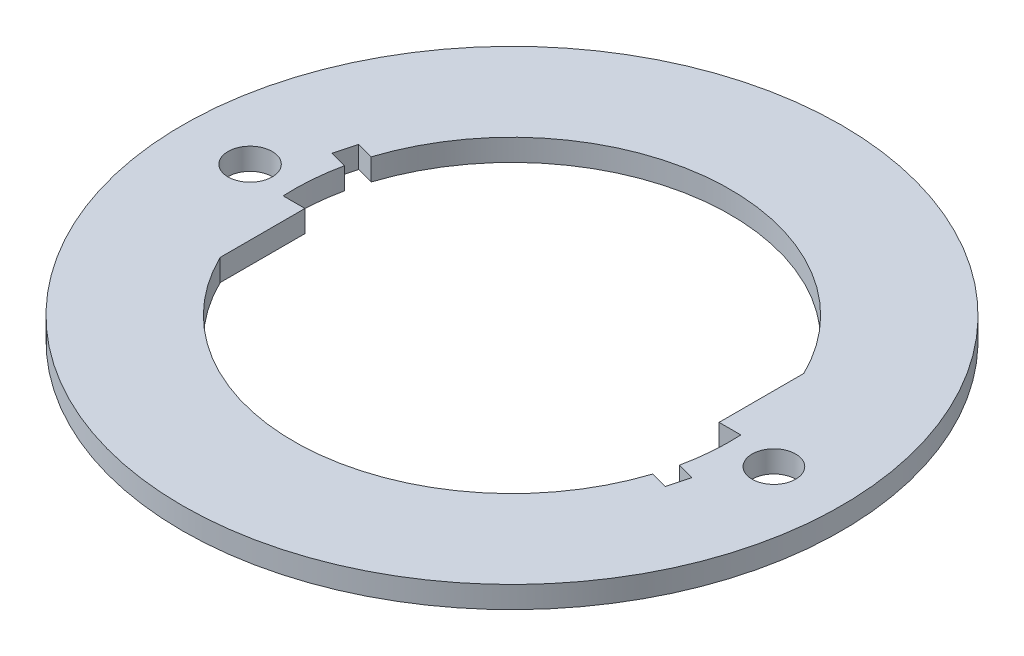
ISO-10303-21;
HEADER;
FILE_DESCRIPTION(('STEP AP214'),'2;1');
FILE_NAME('part.step','',(''),(''),'','','');
FILE_SCHEMA(('AUTOMOTIVE_DESIGN { 1 0 10303 214 1 1 1 1 }'));
ENDSEC;
DATA;
#1=APPLICATION_CONTEXT('core data for automotive mechanical design processes');
#2=APPLICATION_PROTOCOL_DEFINITION('international standard','automotive_design',2000,#1);
#3=PRODUCT_CONTEXT('',#1,'mechanical');
#4=PRODUCT('Part','Part','',(#3));
#5=PRODUCT_RELATED_PRODUCT_CATEGORY('part','',(#4));
#6=PRODUCT_DEFINITION_FORMATION('','',#4);
#7=PRODUCT_DEFINITION_CONTEXT('part definition',#1,'design');
#8=PRODUCT_DEFINITION('design','',#6,#7);
#9=PRODUCT_DEFINITION_SHAPE('','',#8);
#10=(LENGTH_UNIT() NAMED_UNIT(*) SI_UNIT(.MILLI.,.METRE.));
#11=(NAMED_UNIT(*) PLANE_ANGLE_UNIT() SI_UNIT($,.RADIAN.));
#12=(NAMED_UNIT(*) SI_UNIT($,.STERADIAN.) SOLID_ANGLE_UNIT());
#13=UNCERTAINTY_MEASURE_WITH_UNIT(LENGTH_MEASURE(1.E-05),#10,'distance_accuracy_value','');
#14=(GEOMETRIC_REPRESENTATION_CONTEXT(3) GLOBAL_UNCERTAINTY_ASSIGNED_CONTEXT((#13)) GLOBAL_UNIT_ASSIGNED_CONTEXT((#10,
#11,#12)) REPRESENTATION_CONTEXT('',''));
#15=CARTESIAN_POINT('',(0.,0.,0.));
#16=DIRECTION('',(0.,0.,1.));
#17=DIRECTION('',(1.,0.,0.));
#18=AXIS2_PLACEMENT_3D('',#15,#16,#17);
#19=CARTESIAN_POINT('',(0.,3.175,0.));
#20=DIRECTION('',(0.,1.,0.));
#21=DIRECTION('',(0.,0.,1.));
#22=AXIS2_PLACEMENT_3D('',#19,#20,#21);
#23=PLANE('',#22);
#24=CARTESIAN_POINT('',(38.1,3.175,0.));
#25=DIRECTION('',(0.,1.,0.));
#26=DIRECTION('',(0.,0.,1.));
#27=AXIS2_PLACEMENT_3D('',#24,#25,#26);
#28=CIRCLE('',#27,3.175);
#29=CARTESIAN_POINT('',(38.1,3.175,3.17499999999998));
#30=VERTEX_POINT('',#29);
#31=EDGE_CURVE('E236',#30,#30,#28,.T.);
#32=ORIENTED_EDGE('',*,*,#31,.F.);
#33=EDGE_LOOP('',(#32));
#34=FACE_BOUND('',#33,.T.);
#35=CARTESIAN_POINT('',(0.,3.175,0.));
#36=DIRECTION('',(0.,1.,0.));
#37=DIRECTION('',(0.,0.,1.));
#38=AXIS2_PLACEMENT_3D('',#35,#36,#37);
#39=CIRCLE('',#38,47.9425);
#40=CARTESIAN_POINT('',(0.,3.175,47.9425));
#41=VERTEX_POINT('',#40);
#42=EDGE_CURVE('E248',#41,#41,#39,.T.);
#43=ORIENTED_EDGE('',*,*,#42,.T.);
#44=EDGE_LOOP('',(#43));
#45=FACE_BOUND('',#44,.T.);
#46=CARTESIAN_POINT('',(-38.1,3.175,0.));
#47=DIRECTION('',(0.,1.,0.));
#48=DIRECTION('',(0.,0.,1.));
#49=AXIS2_PLACEMENT_3D('',#46,#47,#48);
#50=CIRCLE('',#49,3.2131);
#51=CARTESIAN_POINT('',(-38.1,3.175,3.2131));
#52=VERTEX_POINT('',#51);
#53=EDGE_CURVE('E242',#52,#52,#50,.T.);
#54=ORIENTED_EDGE('',*,*,#53,.F.);
#55=EDGE_LOOP('',(#54));
#56=FACE_BOUND('',#55,.T.);
#57=CARTESIAN_POINT('',(0.,3.175,0.));
#58=DIRECTION('',(0.,1.,0.));
#59=DIRECTION('',(0.,0.,1.));
#60=AXIS2_PLACEMENT_3D('',#57,#58,#59);
#61=CIRCLE('',#60,31.75);
#62=CARTESIAN_POINT('',(-31.040661048063,3.175,-6.67381912395487));
#63=VERTEX_POINT('',#62);
#64=CARTESIAN_POINT('',(-31.7102876642581,3.175,1.58749999999997));
#65=VERTEX_POINT('',#64);
#66=EDGE_CURVE('E195',#63,#65,#61,.T.);
#67=ORIENTED_EDGE('',*,*,#66,.F.);
#68=DIRECTION('',(-0.96592582628907,0.,-0.258819045102514));
#69=VECTOR('',#68,1.);
#70=CARTESIAN_POINT('',(-0.410875234100382,3.175,1.53340724923443));
#71=LINE('',#70,#69);
#72=CARTESIAN_POINT('',(-33.5324718175526,3.175,-7.34149780733077));
#73=VERTEX_POINT('',#72);
#74=EDGE_CURVE('E169',#63,#73,#71,.T.);
#75=ORIENTED_EDGE('',*,*,#74,.T.);
#76=DIRECTION('',(0.258819045102501,0.,-0.965925826289074));
#77=VECTOR('',#76,1.);
#78=CARTESIAN_POINT('',(-33.1215965834523,3.175,-8.87490505656476));
#79=LINE('',#78,#77);
#80=CARTESIAN_POINT('',(-32.7107213493521,3.175,-10.4083123057986));
#81=VERTEX_POINT('',#80);
#82=EDGE_CURVE('E163',#73,#81,#79,.T.);
#83=ORIENTED_EDGE('',*,*,#82,.T.);
#84=DIRECTION('',(0.96592582628907,0.,0.258819045102514));
#85=VECTOR('',#84,1.);
#86=CARTESIAN_POINT('',(0.410875234100099,3.175,-1.53340724923337));
#87=LINE('',#86,#85);
#88=CARTESIAN_POINT('',(-30.2189105798626,3.175,-9.74063362242268));
#89=VERTEX_POINT('',#88);
#90=EDGE_CURVE('E171',#81,#89,#87,.T.);
#91=ORIENTED_EDGE('',*,*,#90,.T.);
#92=CARTESIAN_POINT('',(28.5352876642581,3.175,-13.9212017411587));
#93=VERTEX_POINT('',#92);
#94=EDGE_CURVE('E196',#93,#89,#61,.T.);
#95=ORIENTED_EDGE('',*,*,#94,.F.);
#96=DIRECTION('',(0.,0.,-1.));
#97=VECTOR('',#96,1.);
#98=CARTESIAN_POINT('',(28.5352876642581,3.175,-1.5875));
#99=LINE('',#98,#97);
#100=CARTESIAN_POINT('',(28.5352876642581,3.175,-1.5875));
#101=VERTEX_POINT('',#100);
#102=EDGE_CURVE('E193',#101,#93,#99,.T.);
#103=ORIENTED_EDGE('',*,*,#102,.F.);
#104=DIRECTION('',(-1.,0.,0.));
#105=VECTOR('',#104,1.);
#106=CARTESIAN_POINT('',(31.7102876642581,3.175,-1.5875));
#107=LINE('',#106,#105);
#108=CARTESIAN_POINT('',(31.7102876642581,3.175,-1.5875));
#109=VERTEX_POINT('',#108);
#110=EDGE_CURVE('E190',#109,#101,#107,.T.);
#111=ORIENTED_EDGE('',*,*,#110,.F.);
#112=CARTESIAN_POINT('',(0.,3.175,0.));
#113=DIRECTION('',(0.,1.,0.));
#114=DIRECTION('',(0.,0.,1.));
#115=AXIS2_PLACEMENT_3D('',#112,#113,#114);
#116=CIRCLE('',#115,31.75);
#117=CARTESIAN_POINT('',(31.0406610480627,3.175,6.67381912395594));
#118=VERTEX_POINT('',#117);
#119=EDGE_CURVE('E191',#118,#109,#116,.T.);
#120=ORIENTED_EDGE('',*,*,#119,.F.);
#121=CARTESIAN_POINT('',(33.5324718175523,3.175,7.34149780733183));
#122=VERTEX_POINT('',#121);
#123=EDGE_CURVE('E48',#118,#122,#87,.T.);
#124=ORIENTED_EDGE('',*,*,#123,.T.);
#125=DIRECTION('',(-0.258819045102522,0.,0.965925826289068));
#126=VECTOR('',#125,1.);
#127=CARTESIAN_POINT('',(33.1215965834521,3.175,8.8749050565655));
#128=LINE('',#127,#126);
#129=CARTESIAN_POINT('',(32.7107213493518,3.175,10.4083123057996));
#130=VERTEX_POINT('',#129);
#131=EDGE_CURVE('E168',#122,#130,#128,.T.);
#132=ORIENTED_EDGE('',*,*,#131,.T.);
#133=CARTESIAN_POINT('',(30.2189105798622,3.175,9.74063362242373));
#134=VERTEX_POINT('',#133);
#135=EDGE_CURVE('E152',#130,#134,#71,.T.);
#136=ORIENTED_EDGE('',*,*,#135,.T.);
#137=CARTESIAN_POINT('',(-28.5352876642581,3.175,13.9212017411587));
#138=VERTEX_POINT('',#137);
#139=EDGE_CURVE('E187',#138,#134,#116,.T.);
#140=ORIENTED_EDGE('',*,*,#139,.F.);
#141=DIRECTION('',(0.,0.,1.));
#142=VECTOR('',#141,1.);
#143=CARTESIAN_POINT('',(-28.5352876642581,3.175,1.5875));
#144=LINE('',#143,#142);
#145=CARTESIAN_POINT('',(-28.5352876642581,3.175,1.5875));
#146=VERTEX_POINT('',#145);
#147=EDGE_CURVE('E202',#146,#138,#144,.T.);
#148=ORIENTED_EDGE('',*,*,#147,.F.);
#149=DIRECTION('',(1.,0.,0.));
#150=VECTOR('',#149,1.);
#151=CARTESIAN_POINT('',(-31.7102876642581,3.175,1.5875));
#152=LINE('',#151,#150);
#153=EDGE_CURVE('E199',#65,#146,#152,.T.);
#154=ORIENTED_EDGE('',*,*,#153,.F.);
#155=EDGE_LOOP('',(#67,#75,#83,#91,#95,#103,#111,#120,#124,#132,#136,#140,#148,#154));
#156=FACE_BOUND('',#155,.T.);
#157=ADVANCED_FACE('F33',(#34,#45,#56,#156),#23,.T.);
#158=CARTESIAN_POINT('',(0.,0.,0.));
#159=DIRECTION('',(0.,1.,0.));
#160=DIRECTION('',(0.,0.,1.));
#161=AXIS2_PLACEMENT_3D('',#158,#159,#160);
#162=PLANE('',#161);
#163=CARTESIAN_POINT('',(38.1,0.,0.));
#164=DIRECTION('',(0.,1.,0.));
#165=DIRECTION('',(0.,0.,1.));
#166=AXIS2_PLACEMENT_3D('',#163,#164,#165);
#167=CIRCLE('',#166,3.175);
#168=CARTESIAN_POINT('',(38.1,0.,3.17499999999998));
#169=VERTEX_POINT('',#168);
#170=EDGE_CURVE('E235',#169,#169,#167,.T.);
#171=ORIENTED_EDGE('',*,*,#170,.T.);
#172=EDGE_LOOP('',(#171));
#173=FACE_BOUND('',#172,.T.);
#174=CARTESIAN_POINT('',(0.,0.,0.));
#175=DIRECTION('',(0.,1.,0.));
#176=DIRECTION('',(0.,0.,1.));
#177=AXIS2_PLACEMENT_3D('',#174,#175,#176);
#178=CIRCLE('',#177,47.9425);
#179=CARTESIAN_POINT('',(0.,0.,47.9425));
#180=VERTEX_POINT('',#179);
#181=EDGE_CURVE('E245',#180,#180,#178,.T.);
#182=ORIENTED_EDGE('',*,*,#181,.F.);
#183=EDGE_LOOP('',(#182));
#184=FACE_BOUND('',#183,.T.);
#185=CARTESIAN_POINT('',(-38.1,0.,0.));
#186=DIRECTION('',(0.,1.,0.));
#187=DIRECTION('',(0.,0.,1.));
#188=AXIS2_PLACEMENT_3D('',#185,#186,#187);
#189=CIRCLE('',#188,3.2131);
#190=CARTESIAN_POINT('',(-38.1,0.,3.2131));
#191=VERTEX_POINT('',#190);
#192=EDGE_CURVE('E239',#191,#191,#189,.T.);
#193=ORIENTED_EDGE('',*,*,#192,.T.);
#194=EDGE_LOOP('',(#193));
#195=FACE_BOUND('',#194,.T.);
#196=DIRECTION('',(-0.96592582628907,0.,-0.258819045102514));
#197=VECTOR('',#196,1.);
#198=CARTESIAN_POINT('',(-0.410875234100382,0.,1.53340724923443));
#199=LINE('',#198,#197);
#200=CARTESIAN_POINT('',(-31.040661048063,0.,-6.67381912395487));
#201=VERTEX_POINT('',#200);
#202=CARTESIAN_POINT('',(-33.5324718175526,0.,-7.34149780733077));
#203=VERTEX_POINT('',#202);
#204=EDGE_CURVE('E161',#201,#203,#199,.T.);
#205=ORIENTED_EDGE('',*,*,#204,.F.);
#206=CARTESIAN_POINT('',(0.,0.,0.));
#207=DIRECTION('',(0.,1.,0.));
#208=DIRECTION('',(0.,0.,1.));
#209=AXIS2_PLACEMENT_3D('',#206,#207,#208);
#210=CIRCLE('',#209,31.75);
#211=CARTESIAN_POINT('',(-31.7102876642581,0.,1.58749999999997));
#212=VERTEX_POINT('',#211);
#213=EDGE_CURVE('E212',#201,#212,#210,.T.);
#214=ORIENTED_EDGE('',*,*,#213,.T.);
#215=DIRECTION('',(1.,0.,0.));
#216=VECTOR('',#215,1.);
#217=CARTESIAN_POINT('',(-31.7102876642581,0.,1.5875));
#218=LINE('',#217,#216);
#219=CARTESIAN_POINT('',(-28.5352876642581,0.,1.5875));
#220=VERTEX_POINT('',#219);
#221=EDGE_CURVE('E216',#212,#220,#218,.T.);
#222=ORIENTED_EDGE('',*,*,#221,.T.);
#223=DIRECTION('',(0.,0.,1.));
#224=VECTOR('',#223,1.);
#225=CARTESIAN_POINT('',(-28.5352876642581,0.,1.5875));
#226=LINE('',#225,#224);
#227=CARTESIAN_POINT('',(-28.5352876642581,0.,13.9212017411587));
#228=VERTEX_POINT('',#227);
#229=EDGE_CURVE('E219',#220,#228,#226,.T.);
#230=ORIENTED_EDGE('',*,*,#229,.T.);
#231=CARTESIAN_POINT('',(0.,0.,0.));
#232=DIRECTION('',(0.,1.,0.));
#233=DIRECTION('',(0.,0.,1.));
#234=AXIS2_PLACEMENT_3D('',#231,#232,#233);
#235=CIRCLE('',#234,31.75);
#236=CARTESIAN_POINT('',(30.2189105798622,0.,9.74063362242373));
#237=VERTEX_POINT('',#236);
#238=EDGE_CURVE('E160',#228,#237,#235,.T.);
#239=ORIENTED_EDGE('',*,*,#238,.T.);
#240=CARTESIAN_POINT('',(32.7107213493518,0.,10.4083123057996));
#241=VERTEX_POINT('',#240);
#242=EDGE_CURVE('E146',#241,#237,#199,.T.);
#243=ORIENTED_EDGE('',*,*,#242,.F.);
#244=DIRECTION('',(-0.258819045102522,0.,0.965925826289068));
#245=VECTOR('',#244,1.);
#246=CARTESIAN_POINT('',(33.1215965834521,0.,8.8749050565655));
#247=LINE('',#246,#245);
#248=CARTESIAN_POINT('',(33.5324718175523,0.,7.34149780733183));
#249=VERTEX_POINT('',#248);
#250=EDGE_CURVE('E135',#249,#241,#247,.T.);
#251=ORIENTED_EDGE('',*,*,#250,.F.);
#252=DIRECTION('',(0.96592582628907,0.,0.258819045102514));
#253=VECTOR('',#252,1.);
#254=CARTESIAN_POINT('',(0.410875234100099,0.,-1.53340724923337));
#255=LINE('',#254,#253);
#256=CARTESIAN_POINT('',(31.0406610480627,0.,6.67381912395594));
#257=VERTEX_POINT('',#256);
#258=EDGE_CURVE('E145',#257,#249,#255,.T.);
#259=ORIENTED_EDGE('',*,*,#258,.F.);
#260=CARTESIAN_POINT('',(31.7102876642581,0.,-1.5875));
#261=VERTEX_POINT('',#260);
#262=EDGE_CURVE('E186',#257,#261,#235,.T.);
#263=ORIENTED_EDGE('',*,*,#262,.T.);
#264=DIRECTION('',(-1.,0.,0.));
#265=VECTOR('',#264,1.);
#266=CARTESIAN_POINT('',(31.7102876642581,0.,-1.5875));
#267=LINE('',#266,#265);
#268=CARTESIAN_POINT('',(28.5352876642581,0.,-1.5875));
#269=VERTEX_POINT('',#268);
#270=EDGE_CURVE('E206',#261,#269,#267,.T.);
#271=ORIENTED_EDGE('',*,*,#270,.T.);
#272=DIRECTION('',(0.,0.,-1.));
#273=VECTOR('',#272,1.);
#274=CARTESIAN_POINT('',(28.5352876642581,0.,-1.5875));
#275=LINE('',#274,#273);
#276=CARTESIAN_POINT('',(28.5352876642581,0.,-13.9212017411587));
#277=VERTEX_POINT('',#276);
#278=EDGE_CURVE('E209',#269,#277,#275,.T.);
#279=ORIENTED_EDGE('',*,*,#278,.T.);
#280=CARTESIAN_POINT('',(-30.2189105798626,0.,-9.74063362242268));
#281=VERTEX_POINT('',#280);
#282=EDGE_CURVE('E213',#277,#281,#210,.T.);
#283=ORIENTED_EDGE('',*,*,#282,.T.);
#284=CARTESIAN_POINT('',(-32.7107213493521,0.,-10.4083123057986));
#285=VERTEX_POINT('',#284);
#286=EDGE_CURVE('E56',#285,#281,#255,.T.);
#287=ORIENTED_EDGE('',*,*,#286,.F.);
#288=DIRECTION('',(0.258819045102501,0.,-0.965925826289074));
#289=VECTOR('',#288,1.);
#290=CARTESIAN_POINT('',(-33.1215965834523,0.,-8.87490505656476));
#291=LINE('',#290,#289);
#292=EDGE_CURVE('E154',#203,#285,#291,.T.);
#293=ORIENTED_EDGE('',*,*,#292,.F.);
#294=EDGE_LOOP('',(#205,#214,#222,#230,#239,#243,#251,#259,#263,#271,#279,#283,#287,#293));
#295=FACE_BOUND('',#294,.T.);
#296=ADVANCED_FACE('F158',(#173,#184,#195,#295),#162,.F.);
#297=CARTESIAN_POINT('',(0.,3.175,0.));
#298=DIRECTION('',(0.,-1.,0.));
#299=DIRECTION('',(0.,0.,-1.));
#300=AXIS2_PLACEMENT_3D('',#297,#298,#299);
#301=CYLINDRICAL_SURFACE('',#300,31.75);
#302=ORIENTED_EDGE('',*,*,#139,.T.);
#303=DIRECTION('',(0.,-1.,0.));
#304=VECTOR('',#303,1.);
#305=CARTESIAN_POINT('',(30.2189105798622,3.175,9.74063362242373));
#306=LINE('',#305,#304);
#307=EDGE_CURVE('E184',#134,#237,#306,.T.);
#308=ORIENTED_EDGE('',*,*,#307,.T.);
#309=ORIENTED_EDGE('',*,*,#238,.F.);
#310=DIRECTION('',(0.,-1.,0.));
#311=VECTOR('',#310,1.);
#312=CARTESIAN_POINT('',(-28.5352876642581,3.175,13.9212017411587));
#313=LINE('',#312,#311);
#314=EDGE_CURVE('E204',#138,#228,#313,.T.);
#315=ORIENTED_EDGE('',*,*,#314,.F.);
#316=EDGE_LOOP('',(#302,#308,#309,#315));
#317=FACE_BOUND('',#316,.T.);
#318=ADVANCED_FACE('F289',(#317),#301,.F.);
#319=ORIENTED_EDGE('',*,*,#262,.F.);
#320=DIRECTION('',(0.,-1.,0.));
#321=VECTOR('',#320,1.);
#322=CARTESIAN_POINT('',(31.0406610480627,3.175,6.67381912395594));
#323=LINE('',#322,#321);
#324=EDGE_CURVE('E179',#257,#118,#323,.F.);
#325=ORIENTED_EDGE('',*,*,#324,.T.);
#326=ORIENTED_EDGE('',*,*,#119,.T.);
#327=DIRECTION('',(0.,-1.,0.));
#328=VECTOR('',#327,1.);
#329=CARTESIAN_POINT('',(31.7102876642581,3.175,-1.5875));
#330=LINE('',#329,#328);
#331=EDGE_CURVE('E232',#109,#261,#330,.T.);
#332=ORIENTED_EDGE('',*,*,#331,.T.);
#333=EDGE_LOOP('',(#319,#325,#326,#332));
#334=FACE_BOUND('',#333,.T.);
#335=ADVANCED_FACE('F294',(#334),#301,.F.);
#336=CARTESIAN_POINT('',(0.,3.175,0.));
#337=DIRECTION('',(0.,-1.,0.));
#338=DIRECTION('',(0.,0.,-1.));
#339=AXIS2_PLACEMENT_3D('',#336,#337,#338);
#340=CYLINDRICAL_SURFACE('',#339,31.75);
#341=ORIENTED_EDGE('',*,*,#213,.F.);
#342=DIRECTION('',(0.,-1.,0.));
#343=VECTOR('',#342,1.);
#344=CARTESIAN_POINT('',(-31.040661048063,3.175,-6.67381912395487));
#345=LINE('',#344,#343);
#346=EDGE_CURVE('E11',#201,#63,#345,.F.);
#347=ORIENTED_EDGE('',*,*,#346,.T.);
#348=ORIENTED_EDGE('',*,*,#66,.T.);
#349=DIRECTION('',(0.,-1.,0.));
#350=VECTOR('',#349,1.);
#351=CARTESIAN_POINT('',(-31.7102876642581,3.175,1.58749999999997));
#352=LINE('',#351,#350);
#353=EDGE_CURVE('E225',#65,#212,#352,.T.);
#354=ORIENTED_EDGE('',*,*,#353,.T.);
#355=EDGE_LOOP('',(#341,#347,#348,#354));
#356=FACE_BOUND('',#355,.T.);
#357=ADVANCED_FACE('F276',(#356),#340,.F.);
#358=ORIENTED_EDGE('',*,*,#94,.T.);
#359=DIRECTION('',(0.,-1.,0.));
#360=VECTOR('',#359,1.);
#361=CARTESIAN_POINT('',(-30.2189105798625,3.175,-9.74063362242268));
#362=LINE('',#361,#360);
#363=EDGE_CURVE('E41',#89,#281,#362,.T.);
#364=ORIENTED_EDGE('',*,*,#363,.T.);
#365=ORIENTED_EDGE('',*,*,#282,.F.);
#366=DIRECTION('',(0.,-1.,0.));
#367=VECTOR('',#366,1.);
#368=CARTESIAN_POINT('',(28.5352876642581,3.175,-13.9212017411587));
#369=LINE('',#368,#367);
#370=EDGE_CURVE('E228',#93,#277,#369,.T.);
#371=ORIENTED_EDGE('',*,*,#370,.F.);
#372=EDGE_LOOP('',(#358,#364,#365,#371));
#373=FACE_BOUND('',#372,.T.);
#374=ADVANCED_FACE('F254',(#373),#340,.F.);
#375=CARTESIAN_POINT('',(0.,3.175,0.));
#376=DIRECTION('',(0.,-1.,0.));
#377=DIRECTION('',(0.,0.,-1.));
#378=AXIS2_PLACEMENT_3D('',#375,#376,#377);
#379=CYLINDRICAL_SURFACE('',#378,47.9425);
#380=ORIENTED_EDGE('',*,*,#42,.F.);
#381=EDGE_LOOP('',(#380));
#382=FACE_BOUND('',#381,.T.);
#383=ORIENTED_EDGE('',*,*,#181,.T.);
#384=EDGE_LOOP('',(#383));
#385=FACE_BOUND('',#384,.T.);
#386=ADVANCED_FACE('F35',(#382,#385),#379,.T.);
#387=CARTESIAN_POINT('',(-38.1,3.175,0.));
#388=DIRECTION('',(0.,-1.,0.));
#389=DIRECTION('',(0.,0.,-1.));
#390=AXIS2_PLACEMENT_3D('',#387,#388,#389);
#391=CYLINDRICAL_SURFACE('',#390,3.2131);
#392=ORIENTED_EDGE('',*,*,#53,.T.);
#393=EDGE_LOOP('',(#392));
#394=FACE_BOUND('',#393,.T.);
#395=ORIENTED_EDGE('',*,*,#192,.F.);
#396=EDGE_LOOP('',(#395));
#397=FACE_BOUND('',#396,.T.);
#398=ADVANCED_FACE('F305',(#394,#397),#391,.F.);
#399=CARTESIAN_POINT('',(38.1,3.175,0.));
#400=DIRECTION('',(0.,-1.,0.));
#401=DIRECTION('',(0.,0.,-1.));
#402=AXIS2_PLACEMENT_3D('',#399,#400,#401);
#403=CYLINDRICAL_SURFACE('',#402,3.175);
#404=ORIENTED_EDGE('',*,*,#31,.T.);
#405=EDGE_LOOP('',(#404));
#406=FACE_BOUND('',#405,.T.);
#407=ORIENTED_EDGE('',*,*,#170,.F.);
#408=EDGE_LOOP('',(#407));
#409=FACE_BOUND('',#408,.T.);
#410=ADVANCED_FACE('F298',(#406,#409),#403,.F.);
#411=CARTESIAN_POINT('',(31.7102876642581,3.175,-1.5875));
#412=DIRECTION('',(0.,0.,1.));
#413=DIRECTION('',(1.,0.,0.));
#414=AXIS2_PLACEMENT_3D('',#411,#412,#413);
#415=PLANE('',#414);
#416=ORIENTED_EDGE('',*,*,#270,.F.);
#417=ORIENTED_EDGE('',*,*,#331,.F.);
#418=ORIENTED_EDGE('',*,*,#110,.T.);
#419=DIRECTION('',(0.,-1.,0.));
#420=VECTOR('',#419,1.);
#421=CARTESIAN_POINT('',(28.5352876642581,3.175,-1.5875));
#422=LINE('',#421,#420);
#423=EDGE_CURVE('E230',#101,#269,#422,.T.);
#424=ORIENTED_EDGE('',*,*,#423,.T.);
#425=EDGE_LOOP('',(#416,#417,#418,#424));
#426=FACE_BOUND('',#425,.T.);
#427=ADVANCED_FACE('F296',(#426),#415,.T.);
#428=CARTESIAN_POINT('',(28.5352876642581,3.175,-1.5875));
#429=DIRECTION('',(-1.,0.,0.));
#430=DIRECTION('',(0.,0.,1.));
#431=AXIS2_PLACEMENT_3D('',#428,#429,#430);
#432=PLANE('',#431);
#433=ORIENTED_EDGE('',*,*,#278,.F.);
#434=ORIENTED_EDGE('',*,*,#423,.F.);
#435=ORIENTED_EDGE('',*,*,#102,.T.);
#436=ORIENTED_EDGE('',*,*,#370,.T.);
#437=EDGE_LOOP('',(#433,#434,#435,#436));
#438=FACE_BOUND('',#437,.T.);
#439=ADVANCED_FACE('F263',(#438),#432,.T.);
#440=CARTESIAN_POINT('',(-31.7102876642581,3.175,1.5875));
#441=DIRECTION('',(0.,0.,-1.));
#442=DIRECTION('',(-1.,0.,0.));
#443=AXIS2_PLACEMENT_3D('',#440,#441,#442);
#444=PLANE('',#443);
#445=ORIENTED_EDGE('',*,*,#221,.F.);
#446=ORIENTED_EDGE('',*,*,#353,.F.);
#447=ORIENTED_EDGE('',*,*,#153,.T.);
#448=DIRECTION('',(0.,-1.,0.));
#449=VECTOR('',#448,1.);
#450=CARTESIAN_POINT('',(-28.5352876642581,3.175,1.5875));
#451=LINE('',#450,#449);
#452=EDGE_CURVE('E223',#146,#220,#451,.T.);
#453=ORIENTED_EDGE('',*,*,#452,.T.);
#454=EDGE_LOOP('',(#445,#446,#447,#453));
#455=FACE_BOUND('',#454,.T.);
#456=ADVANCED_FACE('F281',(#455),#444,.T.);
#457=CARTESIAN_POINT('',(-28.5352876642581,3.175,1.5875));
#458=DIRECTION('',(1.,0.,0.));
#459=DIRECTION('',(0.,0.,-1.));
#460=AXIS2_PLACEMENT_3D('',#457,#458,#459);
#461=PLANE('',#460);
#462=ORIENTED_EDGE('',*,*,#229,.F.);
#463=ORIENTED_EDGE('',*,*,#452,.F.);
#464=ORIENTED_EDGE('',*,*,#147,.T.);
#465=ORIENTED_EDGE('',*,*,#314,.T.);
#466=EDGE_LOOP('',(#462,#463,#464,#465));
#467=FACE_BOUND('',#466,.T.);
#468=ADVANCED_FACE('F284',(#467),#461,.T.);
#469=CARTESIAN_POINT('',(-0.410875234100382,0.,1.53340724923443));
#470=DIRECTION('',(0.258819045102514,0.,-0.96592582628907));
#471=DIRECTION('',(-0.96592582628907,0.,-0.258819045102514));
#472=AXIS2_PLACEMENT_3D('',#469,#470,#471);
#473=PLANE('',#472);
#474=ORIENTED_EDGE('',*,*,#204,.T.);
#475=DIRECTION('',(0.,1.,0.));
#476=VECTOR('',#475,1.);
#477=CARTESIAN_POINT('',(-33.5324718175526,0.,-7.34149780733077));
#478=LINE('',#477,#476);
#479=EDGE_CURVE('E176',#203,#73,#478,.T.);
#480=ORIENTED_EDGE('',*,*,#479,.T.);
#481=ORIENTED_EDGE('',*,*,#74,.F.);
#482=ORIENTED_EDGE('',*,*,#346,.F.);
#483=EDGE_LOOP('',(#474,#480,#481,#482));
#484=FACE_BOUND('',#483,.T.);
#485=ADVANCED_FACE('F337',(#484),#473,.T.);
#486=CARTESIAN_POINT('',(0.410875234100099,0.,-1.53340724923337));
#487=DIRECTION('',(-0.258819045102514,0.,0.96592582628907));
#488=DIRECTION('',(0.96592582628907,0.,0.258819045102514));
#489=AXIS2_PLACEMENT_3D('',#486,#487,#488);
#490=PLANE('',#489);
#491=ORIENTED_EDGE('',*,*,#90,.F.);
#492=DIRECTION('',(0.,1.,0.));
#493=VECTOR('',#492,1.);
#494=CARTESIAN_POINT('',(-32.7107213493521,0.,-10.4083123057986));
#495=LINE('',#494,#493);
#496=EDGE_CURVE('E180',#285,#81,#495,.T.);
#497=ORIENTED_EDGE('',*,*,#496,.F.);
#498=ORIENTED_EDGE('',*,*,#286,.T.);
#499=ORIENTED_EDGE('',*,*,#363,.F.);
#500=EDGE_LOOP('',(#491,#497,#498,#499));
#501=FACE_BOUND('',#500,.T.);
#502=ADVANCED_FACE('F269',(#501),#490,.T.);
#503=CARTESIAN_POINT('',(-33.1215965834523,0.,-8.87490505656476));
#504=DIRECTION('',(0.965925826289074,0.,0.258819045102501));
#505=DIRECTION('',(0.258819045102501,0.,-0.965925826289074));
#506=AXIS2_PLACEMENT_3D('',#503,#504,#505);
#507=PLANE('',#506);
#508=ORIENTED_EDGE('',*,*,#82,.F.);
#509=ORIENTED_EDGE('',*,*,#479,.F.);
#510=ORIENTED_EDGE('',*,*,#292,.T.);
#511=ORIENTED_EDGE('',*,*,#496,.T.);
#512=EDGE_LOOP('',(#508,#509,#510,#511));
#513=FACE_BOUND('',#512,.T.);
#514=ADVANCED_FACE('F271',(#513),#507,.T.);
#515=ORIENTED_EDGE('',*,*,#135,.F.);
#516=DIRECTION('',(0.,1.,0.));
#517=VECTOR('',#516,1.);
#518=CARTESIAN_POINT('',(32.7107213493518,0.,10.4083123057996));
#519=LINE('',#518,#517);
#520=EDGE_CURVE('E139',#241,#130,#519,.T.);
#521=ORIENTED_EDGE('',*,*,#520,.F.);
#522=ORIENTED_EDGE('',*,*,#242,.T.);
#523=ORIENTED_EDGE('',*,*,#307,.F.);
#524=EDGE_LOOP('',(#515,#521,#522,#523));
#525=FACE_BOUND('',#524,.T.);
#526=ADVANCED_FACE('F149',(#525),#473,.T.);
#527=ORIENTED_EDGE('',*,*,#258,.T.);
#528=DIRECTION('',(0.,1.,0.));
#529=VECTOR('',#528,1.);
#530=CARTESIAN_POINT('',(33.5324718175523,0.,7.34149780733183));
#531=LINE('',#530,#529);
#532=EDGE_CURVE('E141',#249,#122,#531,.T.);
#533=ORIENTED_EDGE('',*,*,#532,.T.);
#534=ORIENTED_EDGE('',*,*,#123,.F.);
#535=ORIENTED_EDGE('',*,*,#324,.F.);
#536=EDGE_LOOP('',(#527,#533,#534,#535));
#537=FACE_BOUND('',#536,.T.);
#538=ADVANCED_FACE('F342',(#537),#490,.T.);
#539=CARTESIAN_POINT('',(33.1215965834521,0.,8.8749050565655));
#540=DIRECTION('',(-0.965925826289068,0.,-0.258819045102522));
#541=DIRECTION('',(-0.258819045102522,0.,0.965925826289068));
#542=AXIS2_PLACEMENT_3D('',#539,#540,#541);
#543=PLANE('',#542);
#544=ORIENTED_EDGE('',*,*,#131,.F.);
#545=ORIENTED_EDGE('',*,*,#532,.F.);
#546=ORIENTED_EDGE('',*,*,#250,.T.);
#547=ORIENTED_EDGE('',*,*,#520,.T.);
#548=EDGE_LOOP('',(#544,#545,#546,#547));
#549=FACE_BOUND('',#548,.T.);
#550=ADVANCED_FACE('F138',(#549),#543,.T.);
#551=CLOSED_SHELL('',(#157,#296,#318,#335,#357,#374,#386,#398,#410,#427,#439,#456,#468,#485,
#502,#514,#526,#538,#550));
#552=MANIFOLD_SOLID_BREP('B2',#551);
#553=ADVANCED_BREP_SHAPE_REPRESENTATION('',(#18,#552),#14);
#554=SHAPE_DEFINITION_REPRESENTATION(#9,#553);
ENDSEC;
END-ISO-10303-21;
